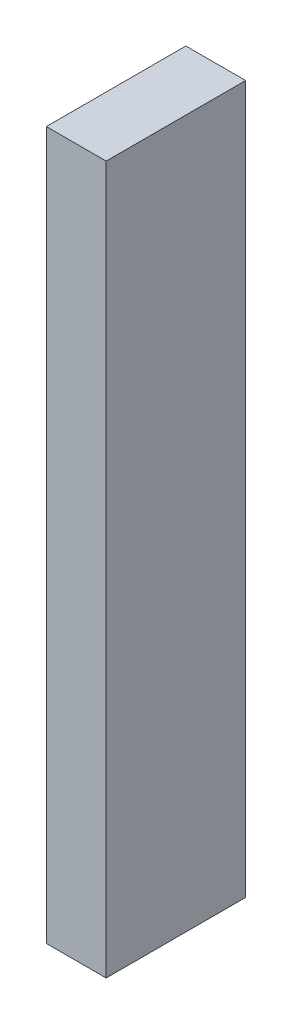
ISO-10303-21;
HEADER;
FILE_DESCRIPTION(('STEP AP214'),'2;1');
FILE_NAME('part.step','',(''),(''),'','','');
FILE_SCHEMA(('AUTOMOTIVE_DESIGN { 1 0 10303 214 1 1 1 1 }'));
ENDSEC;
DATA;
#1=APPLICATION_CONTEXT('core data for automotive mechanical design processes');
#2=APPLICATION_PROTOCOL_DEFINITION('international standard','automotive_design',2000,#1);
#3=PRODUCT_CONTEXT('',#1,'mechanical');
#4=PRODUCT('Part','Part','',(#3));
#5=PRODUCT_RELATED_PRODUCT_CATEGORY('part','',(#4));
#6=PRODUCT_DEFINITION_FORMATION('','',#4);
#7=PRODUCT_DEFINITION_CONTEXT('part definition',#1,'design');
#8=PRODUCT_DEFINITION('design','',#6,#7);
#9=PRODUCT_DEFINITION_SHAPE('','',#8);
#10=(LENGTH_UNIT() NAMED_UNIT(*) SI_UNIT(.MILLI.,.METRE.));
#11=(NAMED_UNIT(*) PLANE_ANGLE_UNIT() SI_UNIT($,.RADIAN.));
#12=(NAMED_UNIT(*) SI_UNIT($,.STERADIAN.) SOLID_ANGLE_UNIT());
#13=UNCERTAINTY_MEASURE_WITH_UNIT(LENGTH_MEASURE(1.E-05),#10,'distance_accuracy_value','');
#14=(GEOMETRIC_REPRESENTATION_CONTEXT(3) GLOBAL_UNCERTAINTY_ASSIGNED_CONTEXT((#13)) GLOBAL_UNIT_ASSIGNED_CONTEXT((#10,
#11,#12)) REPRESENTATION_CONTEXT('',''));
#15=CARTESIAN_POINT('',(0.,0.,0.));
#16=DIRECTION('',(0.,0.,1.));
#17=DIRECTION('',(1.,0.,0.));
#18=AXIS2_PLACEMENT_3D('',#15,#16,#17);
#19=CARTESIAN_POINT('',(19.05,225.425,44.45));
#20=DIRECTION('',(-1.,0.,0.));
#21=DIRECTION('',(0.,0.,1.));
#22=AXIS2_PLACEMENT_3D('',#19,#20,#21);
#23=PLANE('',#22);
#24=DIRECTION('',(0.,0.,-1.));
#25=VECTOR('',#24,1.);
#26=CARTESIAN_POINT('',(19.05,-225.425,44.45));
#27=LINE('',#26,#25);
#28=CARTESIAN_POINT('',(19.05,-225.425,44.45));
#29=VERTEX_POINT('',#28);
#30=CARTESIAN_POINT('',(19.05,-225.425,-44.45));
#31=VERTEX_POINT('',#30);
#32=EDGE_CURVE('E95',#29,#31,#27,.T.);
#33=ORIENTED_EDGE('',*,*,#32,.T.);
#34=DIRECTION('',(0.,-1.,0.));
#35=VECTOR('',#34,1.);
#36=CARTESIAN_POINT('',(19.05,225.425,-44.45));
#37=LINE('',#36,#35);
#38=CARTESIAN_POINT('',(19.05,225.425,-44.45));
#39=VERTEX_POINT('',#38);
#40=EDGE_CURVE('E11',#39,#31,#37,.T.);
#41=ORIENTED_EDGE('',*,*,#40,.F.);
#42=DIRECTION('',(0.,0.,-1.));
#43=VECTOR('',#42,1.);
#44=CARTESIAN_POINT('',(19.05,225.425,44.45));
#45=LINE('',#44,#43);
#46=CARTESIAN_POINT('',(19.05,225.425,44.45));
#47=VERTEX_POINT('',#46);
#48=EDGE_CURVE('E83',#47,#39,#45,.T.);
#49=ORIENTED_EDGE('',*,*,#48,.F.);
#50=DIRECTION('',(0.,-1.,0.));
#51=VECTOR('',#50,1.);
#52=CARTESIAN_POINT('',(19.05,225.425,44.45));
#53=LINE('',#52,#51);
#54=EDGE_CURVE('E91',#47,#29,#53,.T.);
#55=ORIENTED_EDGE('',*,*,#54,.T.);
#56=EDGE_LOOP('',(#33,#41,#49,#55));
#57=FACE_BOUND('',#56,.T.);
#58=ADVANCED_FACE('F32',(#57),#23,.F.);
#59=CARTESIAN_POINT('',(-19.05,225.425,-44.45));
#60=DIRECTION('',(0.,0.,1.));
#61=DIRECTION('',(1.,0.,0.));
#62=AXIS2_PLACEMENT_3D('',#59,#60,#61);
#63=PLANE('',#62);
#64=DIRECTION('',(-1.,0.,0.));
#65=VECTOR('',#64,1.);
#66=CARTESIAN_POINT('',(-19.05,-225.425,-44.45));
#67=LINE('',#66,#65);
#68=CARTESIAN_POINT('',(-19.05,-225.425,-44.45));
#69=VERTEX_POINT('',#68);
#70=EDGE_CURVE('E87',#31,#69,#67,.T.);
#71=ORIENTED_EDGE('',*,*,#70,.T.);
#72=DIRECTION('',(0.,-1.,0.));
#73=VECTOR('',#72,1.);
#74=CARTESIAN_POINT('',(-19.05,225.425,-44.45));
#75=LINE('',#74,#73);
#76=CARTESIAN_POINT('',(-19.05,225.425,-44.45));
#77=VERTEX_POINT('',#76);
#78=EDGE_CURVE('E40',#77,#69,#75,.T.);
#79=ORIENTED_EDGE('',*,*,#78,.F.);
#80=DIRECTION('',(-1.,0.,0.));
#81=VECTOR('',#80,1.);
#82=CARTESIAN_POINT('',(-19.05,225.425,-44.45));
#83=LINE('',#82,#81);
#84=EDGE_CURVE('E78',#39,#77,#83,.T.);
#85=ORIENTED_EDGE('',*,*,#84,.F.);
#86=ORIENTED_EDGE('',*,*,#40,.T.);
#87=EDGE_LOOP('',(#71,#79,#85,#86));
#88=FACE_BOUND('',#87,.T.);
#89=ADVANCED_FACE('F86',(#88),#63,.F.);
#90=CARTESIAN_POINT('',(-19.05,225.425,44.45));
#91=DIRECTION('',(1.,0.,0.));
#92=DIRECTION('',(0.,0.,-1.));
#93=AXIS2_PLACEMENT_3D('',#90,#91,#92);
#94=PLANE('',#93);
#95=DIRECTION('',(0.,0.,1.));
#96=VECTOR('',#95,1.);
#97=CARTESIAN_POINT('',(-19.05,-225.425,44.45));
#98=LINE('',#97,#96);
#99=CARTESIAN_POINT('',(-19.05,-225.425,44.45));
#100=VERTEX_POINT('',#99);
#101=EDGE_CURVE('E65',#69,#100,#98,.T.);
#102=ORIENTED_EDGE('',*,*,#101,.T.);
#103=DIRECTION('',(0.,-1.,0.));
#104=VECTOR('',#103,1.);
#105=CARTESIAN_POINT('',(-19.05,225.425,44.45));
#106=LINE('',#105,#104);
#107=CARTESIAN_POINT('',(-19.05,225.425,44.45));
#108=VERTEX_POINT('',#107);
#109=EDGE_CURVE('E88',#108,#100,#106,.T.);
#110=ORIENTED_EDGE('',*,*,#109,.F.);
#111=DIRECTION('',(0.,0.,1.));
#112=VECTOR('',#111,1.);
#113=CARTESIAN_POINT('',(-19.05,225.425,44.45));
#114=LINE('',#113,#112);
#115=EDGE_CURVE('E81',#77,#108,#114,.T.);
#116=ORIENTED_EDGE('',*,*,#115,.F.);
#117=ORIENTED_EDGE('',*,*,#78,.T.);
#118=EDGE_LOOP('',(#102,#110,#116,#117));
#119=FACE_BOUND('',#118,.T.);
#120=ADVANCED_FACE('F89',(#119),#94,.F.);
#121=CARTESIAN_POINT('',(-19.05,225.425,44.45));
#122=DIRECTION('',(0.,0.,-1.));
#123=DIRECTION('',(-1.,0.,0.));
#124=AXIS2_PLACEMENT_3D('',#121,#122,#123);
#125=PLANE('',#124);
#126=DIRECTION('',(1.,0.,0.));
#127=VECTOR('',#126,1.);
#128=CARTESIAN_POINT('',(-19.05,-225.425,44.45));
#129=LINE('',#128,#127);
#130=EDGE_CURVE('E71',#100,#29,#129,.T.);
#131=ORIENTED_EDGE('',*,*,#130,.T.);
#132=ORIENTED_EDGE('',*,*,#54,.F.);
#133=DIRECTION('',(1.,0.,0.));
#134=VECTOR('',#133,1.);
#135=CARTESIAN_POINT('',(-19.05,225.425,44.45));
#136=LINE('',#135,#134);
#137=EDGE_CURVE('E48',#108,#47,#136,.T.);
#138=ORIENTED_EDGE('',*,*,#137,.F.);
#139=ORIENTED_EDGE('',*,*,#109,.T.);
#140=EDGE_LOOP('',(#131,#132,#138,#139));
#141=FACE_BOUND('',#140,.T.);
#142=ADVANCED_FACE('F102',(#141),#125,.F.);
#143=CARTESIAN_POINT('',(0.,225.425,0.));
#144=DIRECTION('',(0.,-1.,0.));
#145=DIRECTION('',(0.,0.,-1.));
#146=AXIS2_PLACEMENT_3D('',#143,#144,#145);
#147=PLANE('',#146);
#148=ORIENTED_EDGE('',*,*,#48,.T.);
#149=ORIENTED_EDGE('',*,*,#84,.T.);
#150=ORIENTED_EDGE('',*,*,#115,.T.);
#151=ORIENTED_EDGE('',*,*,#137,.T.);
#152=EDGE_LOOP('',(#148,#149,#150,#151));
#153=FACE_BOUND('',#152,.T.);
#154=ADVANCED_FACE('F79',(#153),#147,.F.);
#155=CARTESIAN_POINT('',(0.,-225.425,0.));
#156=DIRECTION('',(0.,-1.,0.));
#157=DIRECTION('',(0.,0.,-1.));
#158=AXIS2_PLACEMENT_3D('',#155,#156,#157);
#159=PLANE('',#158);
#160=ORIENTED_EDGE('',*,*,#32,.F.);
#161=ORIENTED_EDGE('',*,*,#130,.F.);
#162=ORIENTED_EDGE('',*,*,#101,.F.);
#163=ORIENTED_EDGE('',*,*,#70,.F.);
#164=EDGE_LOOP('',(#160,#161,#162,#163));
#165=FACE_BOUND('',#164,.T.);
#166=ADVANCED_FACE('F105',(#165),#159,.T.);
#167=CLOSED_SHELL('',(#58,#89,#120,#142,#154,#166));
#168=MANIFOLD_SOLID_BREP('B2',#167);
#169=ADVANCED_BREP_SHAPE_REPRESENTATION('',(#18,#168),#14);
#170=SHAPE_DEFINITION_REPRESENTATION(#9,#169);
ENDSEC;
END-ISO-10303-21;
